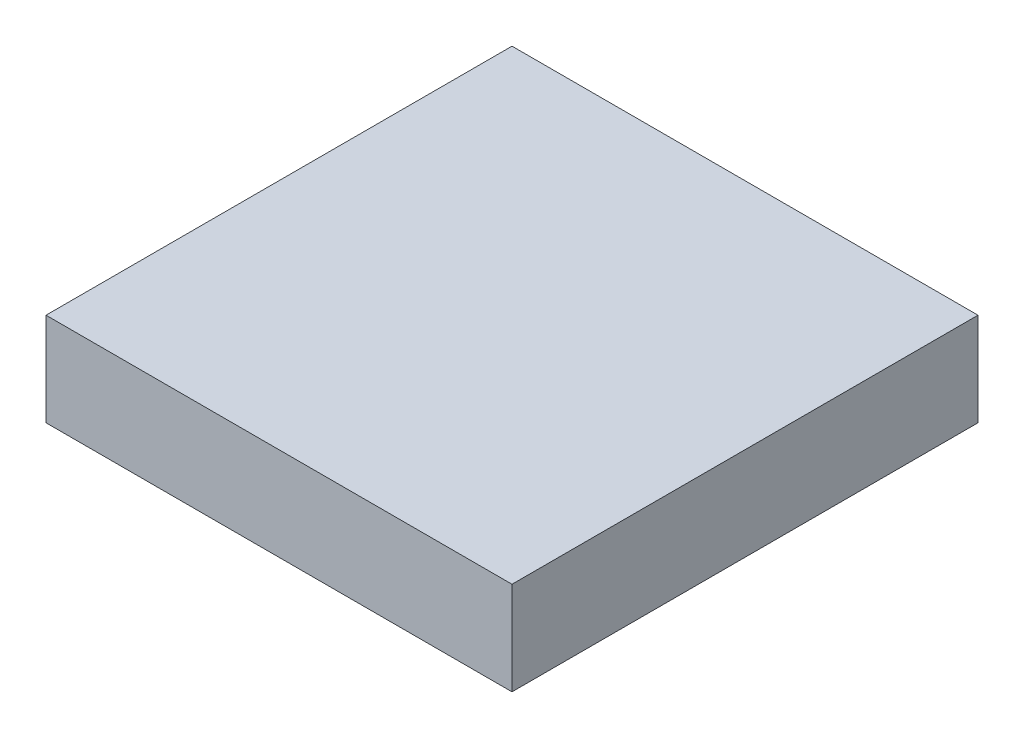
ISO-10303-21;
HEADER;
FILE_DESCRIPTION(('STEP AP214'),'2;1');
FILE_NAME('part.step','',(''),(''),'','','');
FILE_SCHEMA(('AUTOMOTIVE_DESIGN { 1 0 10303 214 1 1 1 1 }'));
ENDSEC;
DATA;
#1=APPLICATION_CONTEXT('core data for automotive mechanical design processes');
#2=APPLICATION_PROTOCOL_DEFINITION('international standard','automotive_design',2000,#1);
#3=PRODUCT_CONTEXT('',#1,'mechanical');
#4=PRODUCT('Part','Part','',(#3));
#5=PRODUCT_RELATED_PRODUCT_CATEGORY('part','',(#4));
#6=PRODUCT_DEFINITION_FORMATION('','',#4);
#7=PRODUCT_DEFINITION_CONTEXT('part definition',#1,'design');
#8=PRODUCT_DEFINITION('design','',#6,#7);
#9=PRODUCT_DEFINITION_SHAPE('','',#8);
#10=(LENGTH_UNIT() NAMED_UNIT(*) SI_UNIT(.MILLI.,.METRE.));
#11=(NAMED_UNIT(*) PLANE_ANGLE_UNIT() SI_UNIT($,.RADIAN.));
#12=(NAMED_UNIT(*) SI_UNIT($,.STERADIAN.) SOLID_ANGLE_UNIT());
#13=UNCERTAINTY_MEASURE_WITH_UNIT(LENGTH_MEASURE(1.E-05),#10,'distance_accuracy_value','');
#14=(GEOMETRIC_REPRESENTATION_CONTEXT(3) GLOBAL_UNCERTAINTY_ASSIGNED_CONTEXT((#13)) GLOBAL_UNIT_ASSIGNED_CONTEXT((#10,
#11,#12)) REPRESENTATION_CONTEXT('',''));
#15=CARTESIAN_POINT('',(0.,0.,0.));
#16=DIRECTION('',(0.,0.,1.));
#17=DIRECTION('',(1.,0.,0.));
#18=AXIS2_PLACEMENT_3D('',#15,#16,#17);
#19=CARTESIAN_POINT('',(0.,7.,0.));
#20=DIRECTION('',(1.,0.,0.));
#21=DIRECTION('',(0.,0.,-1.));
#22=AXIS2_PLACEMENT_3D('',#19,#20,#21);
#23=PLANE('',#22);
#24=DIRECTION('',(0.,0.,1.));
#25=VECTOR('',#24,1.);
#26=CARTESIAN_POINT('',(0.,0.,0.));
#27=LINE('',#26,#25);
#28=CARTESIAN_POINT('',(0.,0.,-35.));
#29=VERTEX_POINT('',#28);
#30=CARTESIAN_POINT('',(0.,0.,0.));
#31=VERTEX_POINT('',#30);
#32=EDGE_CURVE('E96',#29,#31,#27,.T.);
#33=ORIENTED_EDGE('',*,*,#32,.T.);
#34=DIRECTION('',(0.,-1.,0.));
#35=VECTOR('',#34,1.);
#36=CARTESIAN_POINT('',(0.,7.,0.));
#37=LINE('',#36,#35);
#38=CARTESIAN_POINT('',(0.,7.,0.));
#39=VERTEX_POINT('',#38);
#40=EDGE_CURVE('E11',#39,#31,#37,.T.);
#41=ORIENTED_EDGE('',*,*,#40,.F.);
#42=DIRECTION('',(0.,0.,1.));
#43=VECTOR('',#42,1.);
#44=CARTESIAN_POINT('',(0.,7.,0.));
#45=LINE('',#44,#43);
#46=CARTESIAN_POINT('',(0.,7.,-35.));
#47=VERTEX_POINT('',#46);
#48=EDGE_CURVE('E84',#47,#39,#45,.T.);
#49=ORIENTED_EDGE('',*,*,#48,.F.);
#50=DIRECTION('',(0.,-1.,0.));
#51=VECTOR('',#50,1.);
#52=CARTESIAN_POINT('',(0.,7.,-35.));
#53=LINE('',#52,#51);
#54=EDGE_CURVE('E92',#47,#29,#53,.T.);
#55=ORIENTED_EDGE('',*,*,#54,.T.);
#56=EDGE_LOOP('',(#33,#41,#49,#55));
#57=FACE_BOUND('',#56,.T.);
#58=ADVANCED_FACE('F33',(#57),#23,.F.);
#59=CARTESIAN_POINT('',(0.,7.,0.));
#60=DIRECTION('',(0.,0.,-1.));
#61=DIRECTION('',(-1.,0.,0.));
#62=AXIS2_PLACEMENT_3D('',#59,#60,#61);
#63=PLANE('',#62);
#64=DIRECTION('',(1.,0.,0.));
#65=VECTOR('',#64,1.);
#66=CARTESIAN_POINT('',(0.,0.,0.));
#67=LINE('',#66,#65);
#68=CARTESIAN_POINT('',(35.,0.,0.));
#69=VERTEX_POINT('',#68);
#70=EDGE_CURVE('E88',#31,#69,#67,.T.);
#71=ORIENTED_EDGE('',*,*,#70,.T.);
#72=DIRECTION('',(0.,-1.,0.));
#73=VECTOR('',#72,1.);
#74=CARTESIAN_POINT('',(35.,7.,0.));
#75=LINE('',#74,#73);
#76=CARTESIAN_POINT('',(35.,7.,0.));
#77=VERTEX_POINT('',#76);
#78=EDGE_CURVE('E41',#77,#69,#75,.T.);
#79=ORIENTED_EDGE('',*,*,#78,.F.);
#80=DIRECTION('',(1.,0.,0.));
#81=VECTOR('',#80,1.);
#82=CARTESIAN_POINT('',(0.,7.,0.));
#83=LINE('',#82,#81);
#84=EDGE_CURVE('E79',#39,#77,#83,.T.);
#85=ORIENTED_EDGE('',*,*,#84,.F.);
#86=ORIENTED_EDGE('',*,*,#40,.T.);
#87=EDGE_LOOP('',(#71,#79,#85,#86));
#88=FACE_BOUND('',#87,.T.);
#89=ADVANCED_FACE('F87',(#88),#63,.F.);
#90=CARTESIAN_POINT('',(35.,7.,0.));
#91=DIRECTION('',(-1.,0.,0.));
#92=DIRECTION('',(0.,0.,1.));
#93=AXIS2_PLACEMENT_3D('',#90,#91,#92);
#94=PLANE('',#93);
#95=DIRECTION('',(0.,0.,-1.));
#96=VECTOR('',#95,1.);
#97=CARTESIAN_POINT('',(35.,0.,0.));
#98=LINE('',#97,#96);
#99=CARTESIAN_POINT('',(35.,0.,-35.));
#100=VERTEX_POINT('',#99);
#101=EDGE_CURVE('E66',#69,#100,#98,.T.);
#102=ORIENTED_EDGE('',*,*,#101,.T.);
#103=DIRECTION('',(0.,-1.,0.));
#104=VECTOR('',#103,1.);
#105=CARTESIAN_POINT('',(35.,7.,-35.));
#106=LINE('',#105,#104);
#107=CARTESIAN_POINT('',(35.,7.,-35.));
#108=VERTEX_POINT('',#107);
#109=EDGE_CURVE('E89',#108,#100,#106,.T.);
#110=ORIENTED_EDGE('',*,*,#109,.F.);
#111=DIRECTION('',(0.,0.,-1.));
#112=VECTOR('',#111,1.);
#113=CARTESIAN_POINT('',(35.,7.,0.));
#114=LINE('',#113,#112);
#115=EDGE_CURVE('E82',#77,#108,#114,.T.);
#116=ORIENTED_EDGE('',*,*,#115,.F.);
#117=ORIENTED_EDGE('',*,*,#78,.T.);
#118=EDGE_LOOP('',(#102,#110,#116,#117));
#119=FACE_BOUND('',#118,.T.);
#120=ADVANCED_FACE('F90',(#119),#94,.F.);
#121=CARTESIAN_POINT('',(0.,7.,-35.));
#122=DIRECTION('',(0.,0.,1.));
#123=DIRECTION('',(1.,0.,0.));
#124=AXIS2_PLACEMENT_3D('',#121,#122,#123);
#125=PLANE('',#124);
#126=DIRECTION('',(-1.,0.,0.));
#127=VECTOR('',#126,1.);
#128=CARTESIAN_POINT('',(0.,0.,-35.));
#129=LINE('',#128,#127);
#130=EDGE_CURVE('E72',#100,#29,#129,.T.);
#131=ORIENTED_EDGE('',*,*,#130,.T.);
#132=ORIENTED_EDGE('',*,*,#54,.F.);
#133=DIRECTION('',(-1.,0.,0.));
#134=VECTOR('',#133,1.);
#135=CARTESIAN_POINT('',(0.,7.,-35.));
#136=LINE('',#135,#134);
#137=EDGE_CURVE('E49',#108,#47,#136,.T.);
#138=ORIENTED_EDGE('',*,*,#137,.F.);
#139=ORIENTED_EDGE('',*,*,#109,.T.);
#140=EDGE_LOOP('',(#131,#132,#138,#139));
#141=FACE_BOUND('',#140,.T.);
#142=ADVANCED_FACE('F103',(#141),#125,.F.);
#143=CARTESIAN_POINT('',(0.,7.,0.));
#144=DIRECTION('',(0.,-1.,0.));
#145=DIRECTION('',(0.,0.,-1.));
#146=AXIS2_PLACEMENT_3D('',#143,#144,#145);
#147=PLANE('',#146);
#148=ORIENTED_EDGE('',*,*,#48,.T.);
#149=ORIENTED_EDGE('',*,*,#84,.T.);
#150=ORIENTED_EDGE('',*,*,#115,.T.);
#151=ORIENTED_EDGE('',*,*,#137,.T.);
#152=EDGE_LOOP('',(#148,#149,#150,#151));
#153=FACE_BOUND('',#152,.T.);
#154=ADVANCED_FACE('F80',(#153),#147,.F.);
#155=CARTESIAN_POINT('',(0.,0.,0.));
#156=DIRECTION('',(0.,-1.,0.));
#157=DIRECTION('',(0.,0.,-1.));
#158=AXIS2_PLACEMENT_3D('',#155,#156,#157);
#159=PLANE('',#158);
#160=ORIENTED_EDGE('',*,*,#32,.F.);
#161=ORIENTED_EDGE('',*,*,#130,.F.);
#162=ORIENTED_EDGE('',*,*,#101,.F.);
#163=ORIENTED_EDGE('',*,*,#70,.F.);
#164=EDGE_LOOP('',(#160,#161,#162,#163));
#165=FACE_BOUND('',#164,.T.);
#166=ADVANCED_FACE('F106',(#165),#159,.T.);
#167=CLOSED_SHELL('',(#58,#89,#120,#142,#154,#166));
#168=MANIFOLD_SOLID_BREP('B2',#167);
#169=ADVANCED_BREP_SHAPE_REPRESENTATION('',(#18,#168),#14);
#170=SHAPE_DEFINITION_REPRESENTATION(#9,#169);
ENDSEC;
END-ISO-10303-21;
